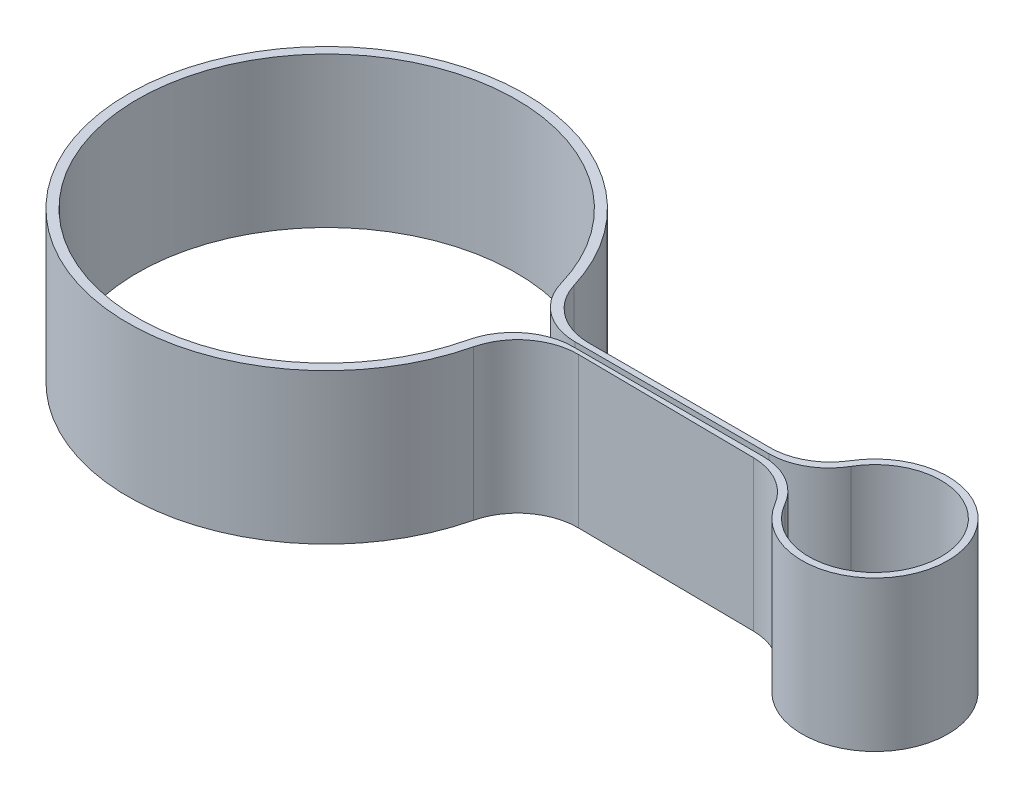
ISO-10303-21;
HEADER;
FILE_DESCRIPTION(('STEP AP214'),'2;1');
FILE_NAME('part.step','',(''),(''),'','','');
FILE_SCHEMA(('AUTOMOTIVE_DESIGN { 1 0 10303 214 1 1 1 1 }'));
ENDSEC;
DATA;
#1=APPLICATION_CONTEXT('core data for automotive mechanical design processes');
#2=APPLICATION_PROTOCOL_DEFINITION('international standard','automotive_design',2000,#1);
#3=PRODUCT_CONTEXT('',#1,'mechanical');
#4=PRODUCT('Part','Part','',(#3));
#5=PRODUCT_RELATED_PRODUCT_CATEGORY('part','',(#4));
#6=PRODUCT_DEFINITION_FORMATION('','',#4);
#7=PRODUCT_DEFINITION_CONTEXT('part definition',#1,'design');
#8=PRODUCT_DEFINITION('design','',#6,#7);
#9=PRODUCT_DEFINITION_SHAPE('','',#8);
#10=(LENGTH_UNIT() NAMED_UNIT(*) SI_UNIT(.MILLI.,.METRE.));
#11=(NAMED_UNIT(*) PLANE_ANGLE_UNIT() SI_UNIT($,.RADIAN.));
#12=(NAMED_UNIT(*) SI_UNIT($,.STERADIAN.) SOLID_ANGLE_UNIT());
#13=UNCERTAINTY_MEASURE_WITH_UNIT(LENGTH_MEASURE(1.E-05),#10,'distance_accuracy_value','');
#14=(GEOMETRIC_REPRESENTATION_CONTEXT(3) GLOBAL_UNCERTAINTY_ASSIGNED_CONTEXT((#13)) GLOBAL_UNIT_ASSIGNED_CONTEXT((#10,
#11,#12)) REPRESENTATION_CONTEXT('',''));
#15=CARTESIAN_POINT('',(0.,0.,0.));
#16=DIRECTION('',(0.,0.,1.));
#17=DIRECTION('',(1.,0.,0.));
#18=AXIS2_PLACEMENT_3D('',#15,#16,#17);
#19=CARTESIAN_POINT('',(34.1578856722715,25.,53.941585042736));
#20=DIRECTION('',(0.,1.,0.));
#21=DIRECTION('',(0.,0.,1.));
#22=AXIS2_PLACEMENT_3D('',#19,#20,#21);
#23=PLANE('',#22);
#24=CARTESIAN_POINT('',(124.422920084334,25.,52.9901319635585));
#25=DIRECTION('',(0.,1.,0.));
#26=DIRECTION('',(0.,0.,1.));
#27=AXIS2_PLACEMENT_3D('',#24,#25,#26);
#28=CIRCLE('',#27,12.1361849976581);
#29=CARTESIAN_POINT('',(113.998690265068,25.,59.2048257591141));
#30=VERTEX_POINT('',#29);
#31=CARTESIAN_POINT('',(114.049539549785,25.,46.690928634341));
#32=VERTEX_POINT('',#31);
#33=EDGE_CURVE('E274',#30,#32,#28,.T.);
#34=ORIENTED_EDGE('',*,*,#33,.T.);
#35=CARTESIAN_POINT('',(105.502058989336,25.,41.5004974317571));
#36=DIRECTION('',(0.,1.,0.));
#37=DIRECTION('',(0.,0.,1.));
#38=AXIS2_PLACEMENT_3D('',#35,#36,#37);
#39=CIRCLE('',#38,10.);
#40=CARTESIAN_POINT('',(105.502058989336,25.,51.5004974317571));
#41=VERTEX_POINT('',#40);
#42=EDGE_CURVE('E229',#32,#41,#39,.F.);
#43=ORIENTED_EDGE('',*,*,#42,.T.);
#44=DIRECTION('',(-1.,0.,0.));
#45=VECTOR('',#44,1.);
#46=CARTESIAN_POINT('',(67.1016716609574,25.,51.5004974317571));
#47=LINE('',#46,#45);
#48=CARTESIAN_POINT('',(75.3544066163508,25.,51.5004974317571));
#49=VERTEX_POINT('',#48);
#50=EDGE_CURVE('E159',#41,#49,#47,.T.);
#51=ORIENTED_EDGE('',*,*,#50,.T.);
#52=CARTESIAN_POINT('',(75.3544066163508,25.,41.5004974317571));
#53=DIRECTION('',(0.,1.,0.));
#54=DIRECTION('',(0.,0.,1.));
#55=AXIS2_PLACEMENT_3D('',#52,#53,#54);
#56=CIRCLE('',#55,10.);
#57=CARTESIAN_POINT('',(65.7814125677197,25.,44.3914808189239));
#58=VERTEX_POINT('',#57);
#59=EDGE_CURVE('E201',#49,#58,#56,.F.);
#60=ORIENTED_EDGE('',*,*,#59,.T.);
#61=CARTESIAN_POINT('',(34.1578856722715,25.,53.941585042736));
#62=DIRECTION('',(0.,1.,0.));
#63=DIRECTION('',(0.,0.,1.));
#64=AXIS2_PLACEMENT_3D('',#61,#62,#63);
#65=CIRCLE('',#64,33.0341027423602);
#66=CARTESIAN_POINT('',(66.2746295842427,25.,61.672477907449));
#67=VERTEX_POINT('',#66);
#68=EDGE_CURVE('E173',#58,#67,#65,.T.);
#69=ORIENTED_EDGE('',*,*,#68,.T.);
#70=CARTESIAN_POINT('',(75.9969290401887,25.,64.0127542349181));
#71=DIRECTION('',(0.,1.,0.));
#72=DIRECTION('',(0.,0.,1.));
#73=AXIS2_PLACEMENT_3D('',#70,#71,#72);
#74=CIRCLE('',#73,10.);
#75=CARTESIAN_POINT('',(76.1032960394246,25.,54.013319947846));
#76=VERTEX_POINT('',#75);
#77=EDGE_CURVE('E154',#67,#76,#74,.F.);
#78=ORIENTED_EDGE('',*,*,#77,.T.);
#79=DIRECTION('',(0.999943428707212,0.,0.0106366999235841));
#80=VECTOR('',#79,1.);
#81=CARTESIAN_POINT('',(67.1919803677054,25.,53.9185275945956));
#82=LINE('',#81,#80);
#83=CARTESIAN_POINT('',(105.515677800101,25.,54.3261883260408));
#84=VERTEX_POINT('',#83);
#85=EDGE_CURVE('E158',#76,#84,#82,.T.);
#86=ORIENTED_EDGE('',*,*,#85,.T.);
#87=CARTESIAN_POINT('',(105.409310800865,25.,64.3256226131129));
#88=DIRECTION('',(0.,1.,0.));
#89=DIRECTION('',(0.,0.,1.));
#90=AXIS2_PLACEMENT_3D('',#87,#88,#89);
#91=CIRCLE('',#90,10.);
#92=EDGE_CURVE('E232',#84,#30,#91,.F.);
#93=ORIENTED_EDGE('',*,*,#92,.T.);
#94=EDGE_LOOP('',(#34,#43,#51,#60,#69,#78,#86,#93));
#95=FACE_BOUND('',#94,.T.);
#96=DIRECTION('',(-1.,0.,0.));
#97=VECTOR('',#96,1.);
#98=CARTESIAN_POINT('',(65.6237177244648,25.,52.4748153733051));
#99=LINE('',#98,#97);
#100=CARTESIAN_POINT('',(106.245238246246,25.,52.4748153733051));
#101=VERTEX_POINT('',#100);
#102=CARTESIAN_POINT('',(74.042258468496,25.,52.4748153733051));
#103=VERTEX_POINT('',#102);
#104=EDGE_CURVE('E169',#101,#103,#99,.T.);
#105=ORIENTED_EDGE('',*,*,#104,.F.);
#106=CARTESIAN_POINT('',(106.245238246246,25.,42.4748153733051));
#107=DIRECTION('',(0.,1.,0.));
#108=DIRECTION('',(0.,0.,1.));
#109=AXIS2_PLACEMENT_3D('',#106,#107,#108);
#110=CIRCLE('',#109,10.);
#111=CARTESIAN_POINT('',(114.901277216764,25.,47.4821089877115));
#112=VERTEX_POINT('',#111);
#113=EDGE_CURVE('E11',#101,#112,#110,.T.);
#114=ORIENTED_EDGE('',*,*,#113,.T.);
#115=CARTESIAN_POINT('',(124.422920084334,25.,52.9901319635585));
#116=DIRECTION('',(0.,1.,0.));
#117=DIRECTION('',(0.,0.,1.));
#118=AXIS2_PLACEMENT_3D('',#115,#116,#117);
#119=CIRCLE('',#118,11.);
#120=CARTESIAN_POINT('',(114.85306942242,25.,58.4139644009294));
#121=VERTEX_POINT('',#120);
#122=EDGE_CURVE('E246',#121,#112,#119,.T.);
#123=ORIENTED_EDGE('',*,*,#122,.F.);
#124=CARTESIAN_POINT('',(106.153205184317,25.,63.3447211621756));
#125=DIRECTION('',(0.,1.,0.));
#126=DIRECTION('',(0.,0.,1.));
#127=AXIS2_PLACEMENT_3D('',#124,#125,#126);
#128=CIRCLE('',#127,10.);
#129=CARTESIAN_POINT('',(106.153318338104,25.,53.3447211628158));
#130=VERTEX_POINT('',#129);
#131=EDGE_CURVE('E39',#121,#130,#128,.T.);
#132=ORIENTED_EDGE('',*,*,#131,.T.);
#133=DIRECTION('',(0.999999999935981,0.,1.13153786721083E-05));
#134=VECTOR('',#133,1.);
#135=CARTESIAN_POINT('',(65.6522217699098,25.,53.3442628775714));
#136=LINE('',#135,#134);
#137=CARTESIAN_POINT('',(74.5787577261709,25.,53.344363884706));
#138=VERTEX_POINT('',#137);
#139=EDGE_CURVE('E243',#138,#130,#136,.T.);
#140=ORIENTED_EDGE('',*,*,#139,.F.);
#141=CARTESIAN_POINT('',(74.5786445723842,25.,63.3443638840658));
#142=DIRECTION('',(0.,1.,0.));
#143=DIRECTION('',(0.,0.,1.));
#144=AXIS2_PLACEMENT_3D('',#141,#142,#143);
#145=CIRCLE('',#144,10.);
#146=CARTESIAN_POINT('',(64.8387026687426,25.,61.0786340427815));
#147=VERTEX_POINT('',#146);
#148=EDGE_CURVE('E184',#138,#147,#145,.T.);
#149=ORIENTED_EDGE('',*,*,#148,.T.);
#150=CARTESIAN_POINT('',(34.1578856722715,25.,53.941585042736));
#151=DIRECTION('',(0.,1.,0.));
#152=DIRECTION('',(0.,0.,1.));
#153=AXIS2_PLACEMENT_3D('',#150,#151,#152);
#154=CIRCLE('',#153,31.5);
#155=CARTESIAN_POINT('',(64.4315662284419,25.,45.2378924020836));
#156=VERTEX_POINT('',#155);
#157=EDGE_CURVE('E255',#156,#147,#154,.T.);
#158=ORIENTED_EDGE('',*,*,#157,.F.);
#159=CARTESIAN_POINT('',(74.042258468496,25.,42.4748153733051));
#160=DIRECTION('',(0.,1.,0.));
#161=DIRECTION('',(0.,0.,1.));
#162=AXIS2_PLACEMENT_3D('',#159,#160,#161);
#163=CIRCLE('',#162,10.);
#164=EDGE_CURVE('E205',#156,#103,#163,.T.);
#165=ORIENTED_EDGE('',*,*,#164,.T.);
#166=EDGE_LOOP('',(#105,#114,#123,#132,#140,#149,#158,#165));
#167=FACE_BOUND('',#166,.T.);
#168=ADVANCED_FACE('F31',(#95,#167),#23,.T.);
#169=CARTESIAN_POINT('',(34.1578856722715,0.,53.941585042736));
#170=DIRECTION('',(0.,1.,0.));
#171=DIRECTION('',(0.,0.,1.));
#172=AXIS2_PLACEMENT_3D('',#169,#170,#171);
#173=PLANE('',#172);
#174=CARTESIAN_POINT('',(34.1578856722715,0.,53.941585042736));
#175=DIRECTION('',(0.,1.,0.));
#176=DIRECTION('',(0.,0.,1.));
#177=AXIS2_PLACEMENT_3D('',#174,#175,#176);
#178=CIRCLE('',#177,33.0341027423602);
#179=CARTESIAN_POINT('',(65.7814125677197,0.,44.3914808189239));
#180=VERTEX_POINT('',#179);
#181=CARTESIAN_POINT('',(66.2746295842427,0.,61.672477907449));
#182=VERTEX_POINT('',#181);
#183=EDGE_CURVE('E164',#180,#182,#178,.T.);
#184=ORIENTED_EDGE('',*,*,#183,.F.);
#185=CARTESIAN_POINT('',(75.3544066163508,0.,41.5004974317571));
#186=DIRECTION('',(0.,1.,0.));
#187=DIRECTION('',(0.,0.,1.));
#188=AXIS2_PLACEMENT_3D('',#185,#186,#187);
#189=CIRCLE('',#188,10.);
#190=CARTESIAN_POINT('',(75.3544066163508,0.,51.5004974317571));
#191=VERTEX_POINT('',#190);
#192=EDGE_CURVE('E198',#180,#191,#189,.T.);
#193=ORIENTED_EDGE('',*,*,#192,.T.);
#194=DIRECTION('',(-1.,0.,0.));
#195=VECTOR('',#194,1.);
#196=CARTESIAN_POINT('',(67.1016716609574,0.,51.5004974317571));
#197=LINE('',#196,#195);
#198=CARTESIAN_POINT('',(105.502058989336,0.,51.5004974317571));
#199=VERTEX_POINT('',#198);
#200=EDGE_CURVE('E167',#199,#191,#197,.T.);
#201=ORIENTED_EDGE('',*,*,#200,.F.);
#202=CARTESIAN_POINT('',(105.502058989336,0.,41.5004974317571));
#203=DIRECTION('',(0.,1.,0.));
#204=DIRECTION('',(0.,0.,1.));
#205=AXIS2_PLACEMENT_3D('',#202,#203,#204);
#206=CIRCLE('',#205,10.);
#207=CARTESIAN_POINT('',(114.049539549785,0.,46.690928634341));
#208=VERTEX_POINT('',#207);
#209=EDGE_CURVE('E227',#199,#208,#206,.T.);
#210=ORIENTED_EDGE('',*,*,#209,.T.);
#211=CARTESIAN_POINT('',(124.422920084334,0.,52.9901319635585));
#212=DIRECTION('',(0.,1.,0.));
#213=DIRECTION('',(0.,0.,1.));
#214=AXIS2_PLACEMENT_3D('',#211,#212,#213);
#215=CIRCLE('',#214,12.1361849976581);
#216=CARTESIAN_POINT('',(113.998690265068,0.,59.2048257591141));
#217=VERTEX_POINT('',#216);
#218=EDGE_CURVE('E163',#217,#208,#215,.T.);
#219=ORIENTED_EDGE('',*,*,#218,.F.);
#220=CARTESIAN_POINT('',(105.409310800865,0.,64.3256226131129));
#221=DIRECTION('',(0.,1.,0.));
#222=DIRECTION('',(0.,0.,1.));
#223=AXIS2_PLACEMENT_3D('',#220,#221,#222);
#224=CIRCLE('',#223,10.);
#225=CARTESIAN_POINT('',(105.515677800101,0.,54.3261883260408));
#226=VERTEX_POINT('',#225);
#227=EDGE_CURVE('E46',#217,#226,#224,.T.);
#228=ORIENTED_EDGE('',*,*,#227,.T.);
#229=DIRECTION('',(0.999943428707212,0.,0.0106366999235841));
#230=VECTOR('',#229,1.);
#231=CARTESIAN_POINT('',(67.1919803677054,0.,53.9185275945956));
#232=LINE('',#231,#230);
#233=CARTESIAN_POINT('',(76.1032960394246,0.,54.013319947846));
#234=VERTEX_POINT('',#233);
#235=EDGE_CURVE('E157',#234,#226,#232,.T.);
#236=ORIENTED_EDGE('',*,*,#235,.F.);
#237=CARTESIAN_POINT('',(75.9969290401887,0.,64.0127542349181));
#238=DIRECTION('',(0.,1.,0.));
#239=DIRECTION('',(0.,0.,1.));
#240=AXIS2_PLACEMENT_3D('',#237,#238,#239);
#241=CIRCLE('',#240,10.);
#242=EDGE_CURVE('E146',#234,#182,#241,.T.);
#243=ORIENTED_EDGE('',*,*,#242,.T.);
#244=EDGE_LOOP('',(#184,#193,#201,#210,#219,#228,#236,#243));
#245=FACE_BOUND('',#244,.T.);
#246=CARTESIAN_POINT('',(124.422920084334,0.,52.9901319635585));
#247=DIRECTION('',(0.,1.,0.));
#248=DIRECTION('',(0.,0.,1.));
#249=AXIS2_PLACEMENT_3D('',#246,#247,#248);
#250=CIRCLE('',#249,11.);
#251=CARTESIAN_POINT('',(114.85306942242,0.,58.4139644009294));
#252=VERTEX_POINT('',#251);
#253=CARTESIAN_POINT('',(114.901277216764,0.,47.4821089877115));
#254=VERTEX_POINT('',#253);
#255=EDGE_CURVE('E260',#252,#254,#250,.T.);
#256=ORIENTED_EDGE('',*,*,#255,.T.);
#257=CARTESIAN_POINT('',(106.245238246246,0.,42.4748153733051));
#258=DIRECTION('',(0.,1.,0.));
#259=DIRECTION('',(0.,0.,1.));
#260=AXIS2_PLACEMENT_3D('',#257,#258,#259);
#261=CIRCLE('',#260,10.);
#262=CARTESIAN_POINT('',(106.245238246246,0.,52.4748153733051));
#263=VERTEX_POINT('',#262);
#264=EDGE_CURVE('E236',#254,#263,#261,.F.);
#265=ORIENTED_EDGE('',*,*,#264,.T.);
#266=DIRECTION('',(-1.,0.,0.));
#267=VECTOR('',#266,1.);
#268=CARTESIAN_POINT('',(65.6237177244648,0.,52.4748153733051));
#269=LINE('',#268,#267);
#270=CARTESIAN_POINT('',(74.042258468496,0.,52.4748153733051));
#271=VERTEX_POINT('',#270);
#272=EDGE_CURVE('E265',#263,#271,#269,.T.);
#273=ORIENTED_EDGE('',*,*,#272,.T.);
#274=CARTESIAN_POINT('',(74.042258468496,0.,42.4748153733051));
#275=DIRECTION('',(0.,1.,0.));
#276=DIRECTION('',(0.,0.,1.));
#277=AXIS2_PLACEMENT_3D('',#274,#275,#276);
#278=CIRCLE('',#277,10.);
#279=CARTESIAN_POINT('',(64.4315662284419,0.,45.2378924020836));
#280=VERTEX_POINT('',#279);
#281=EDGE_CURVE('E203',#271,#280,#278,.F.);
#282=ORIENTED_EDGE('',*,*,#281,.T.);
#283=CARTESIAN_POINT('',(34.1578856722715,0.,53.941585042736));
#284=DIRECTION('',(0.,1.,0.));
#285=DIRECTION('',(0.,0.,1.));
#286=AXIS2_PLACEMENT_3D('',#283,#284,#285);
#287=CIRCLE('',#286,31.5);
#288=CARTESIAN_POINT('',(64.8387026687426,0.,61.0786340427815));
#289=VERTEX_POINT('',#288);
#290=EDGE_CURVE('E268',#280,#289,#287,.T.);
#291=ORIENTED_EDGE('',*,*,#290,.T.);
#292=CARTESIAN_POINT('',(74.5786445723842,0.,63.3443638840658));
#293=DIRECTION('',(0.,1.,0.));
#294=DIRECTION('',(0.,0.,1.));
#295=AXIS2_PLACEMENT_3D('',#292,#293,#294);
#296=CIRCLE('',#295,10.);
#297=CARTESIAN_POINT('',(74.5787577261709,0.,53.344363884706));
#298=VERTEX_POINT('',#297);
#299=EDGE_CURVE('E180',#289,#298,#296,.F.);
#300=ORIENTED_EDGE('',*,*,#299,.T.);
#301=DIRECTION('',(0.999999999935981,0.,1.13153786721083E-05));
#302=VECTOR('',#301,1.);
#303=CARTESIAN_POINT('',(65.6522217699098,0.,53.3442628775714));
#304=LINE('',#303,#302);
#305=CARTESIAN_POINT('',(106.153318338104,0.,53.3447211628158));
#306=VERTEX_POINT('',#305);
#307=EDGE_CURVE('E261',#298,#306,#304,.T.);
#308=ORIENTED_EDGE('',*,*,#307,.T.);
#309=CARTESIAN_POINT('',(106.153205184317,0.,63.3447211621756));
#310=DIRECTION('',(0.,1.,0.));
#311=DIRECTION('',(0.,0.,1.));
#312=AXIS2_PLACEMENT_3D('',#309,#310,#311);
#313=CIRCLE('',#312,10.);
#314=EDGE_CURVE('E234',#306,#252,#313,.F.);
#315=ORIENTED_EDGE('',*,*,#314,.T.);
#316=EDGE_LOOP('',(#256,#265,#273,#282,#291,#300,#308,#315));
#317=FACE_BOUND('',#316,.T.);
#318=ADVANCED_FACE('F161',(#245,#317),#173,.F.);
#319=CARTESIAN_POINT('',(34.1578856722715,25.,53.941585042736));
#320=DIRECTION('',(0.,-1.,0.));
#321=DIRECTION('',(0.,0.,-1.));
#322=AXIS2_PLACEMENT_3D('',#319,#320,#321);
#323=CYLINDRICAL_SURFACE('',#322,33.0341027423602);
#324=ORIENTED_EDGE('',*,*,#68,.F.);
#325=DIRECTION('',(0.,-1.,0.));
#326=VECTOR('',#325,1.);
#327=CARTESIAN_POINT('',(65.7814125677197,25.,44.3914808189239));
#328=LINE('',#327,#326);
#329=EDGE_CURVE('E187',#58,#180,#328,.T.);
#330=ORIENTED_EDGE('',*,*,#329,.T.);
#331=ORIENTED_EDGE('',*,*,#183,.T.);
#332=DIRECTION('',(0.,-1.,0.));
#333=VECTOR('',#332,1.);
#334=CARTESIAN_POINT('',(66.2746295842427,25.,61.672477907449));
#335=LINE('',#334,#333);
#336=EDGE_CURVE('E152',#182,#67,#335,.F.);
#337=ORIENTED_EDGE('',*,*,#336,.T.);
#338=EDGE_LOOP('',(#324,#330,#331,#337));
#339=FACE_BOUND('',#338,.T.);
#340=ADVANCED_FACE('F290',(#339),#323,.T.);
#341=CARTESIAN_POINT('',(67.1919803677054,25.,53.9185275945956));
#342=DIRECTION('',(0.0106366999235841,0.,-0.999943428707212));
#343=DIRECTION('',(-0.999943428707212,0.,-0.0106366999235841));
#344=AXIS2_PLACEMENT_3D('',#341,#342,#343);
#345=PLANE('',#344);
#346=ORIENTED_EDGE('',*,*,#235,.T.);
#347=DIRECTION('',(0.,1.,0.));
#348=VECTOR('',#347,1.);
#349=CARTESIAN_POINT('',(105.515677800101,25.,54.3261883260408));
#350=LINE('',#349,#348);
#351=EDGE_CURVE('E53',#226,#84,#350,.T.);
#352=ORIENTED_EDGE('',*,*,#351,.T.);
#353=ORIENTED_EDGE('',*,*,#85,.F.);
#354=DIRECTION('',(0.,1.,0.));
#355=VECTOR('',#354,1.);
#356=CARTESIAN_POINT('',(76.1032960394246,0.,54.013319947846));
#357=LINE('',#356,#355);
#358=EDGE_CURVE('E150',#76,#234,#357,.F.);
#359=ORIENTED_EDGE('',*,*,#358,.T.);
#360=EDGE_LOOP('',(#346,#352,#353,#359));
#361=FACE_BOUND('',#360,.T.);
#362=ADVANCED_FACE('F156',(#361),#345,.F.);
#363=CARTESIAN_POINT('',(124.422920084334,25.,52.9901319635585));
#364=DIRECTION('',(0.,-1.,0.));
#365=DIRECTION('',(0.,0.,-1.));
#366=AXIS2_PLACEMENT_3D('',#363,#364,#365);
#367=CYLINDRICAL_SURFACE('',#366,12.1361849976581);
#368=ORIENTED_EDGE('',*,*,#218,.T.);
#369=DIRECTION('',(0.,-1.,0.));
#370=VECTOR('',#369,1.);
#371=CARTESIAN_POINT('',(114.049539549785,25.,46.690928634341));
#372=LINE('',#371,#370);
#373=EDGE_CURVE('E224',#208,#32,#372,.F.);
#374=ORIENTED_EDGE('',*,*,#373,.T.);
#375=ORIENTED_EDGE('',*,*,#33,.F.);
#376=DIRECTION('',(0.,-1.,0.));
#377=VECTOR('',#376,1.);
#378=CARTESIAN_POINT('',(113.998690265068,25.,59.2048257591141));
#379=LINE('',#378,#377);
#380=EDGE_CURVE('E221',#30,#217,#379,.T.);
#381=ORIENTED_EDGE('',*,*,#380,.T.);
#382=EDGE_LOOP('',(#368,#374,#375,#381));
#383=FACE_BOUND('',#382,.T.);
#384=ADVANCED_FACE('F294',(#383),#367,.T.);
#385=CARTESIAN_POINT('',(67.1016716609574,25.,51.5004974317571));
#386=DIRECTION('',(0.,0.,1.));
#387=DIRECTION('',(1.,0.,0.));
#388=AXIS2_PLACEMENT_3D('',#385,#386,#387);
#389=PLANE('',#388);
#390=ORIENTED_EDGE('',*,*,#50,.F.);
#391=DIRECTION('',(0.,1.,0.));
#392=VECTOR('',#391,1.);
#393=CARTESIAN_POINT('',(105.502058989336,0.,51.5004974317571));
#394=LINE('',#393,#392);
#395=EDGE_CURVE('E218',#41,#199,#394,.F.);
#396=ORIENTED_EDGE('',*,*,#395,.T.);
#397=ORIENTED_EDGE('',*,*,#200,.T.);
#398=DIRECTION('',(0.,1.,0.));
#399=VECTOR('',#398,1.);
#400=CARTESIAN_POINT('',(75.3544066163508,25.,51.5004974317571));
#401=LINE('',#400,#399);
#402=EDGE_CURVE('E190',#191,#49,#401,.T.);
#403=ORIENTED_EDGE('',*,*,#402,.T.);
#404=EDGE_LOOP('',(#390,#396,#397,#403));
#405=FACE_BOUND('',#404,.T.);
#406=ADVANCED_FACE('F284',(#405),#389,.F.);
#407=CARTESIAN_POINT('',(34.1578856722715,25.,53.941585042736));
#408=DIRECTION('',(0.,-1.,0.));
#409=DIRECTION('',(0.,0.,-1.));
#410=AXIS2_PLACEMENT_3D('',#407,#408,#409);
#411=CYLINDRICAL_SURFACE('',#410,31.5);
#412=ORIENTED_EDGE('',*,*,#290,.F.);
#413=DIRECTION('',(0.,-1.,0.));
#414=VECTOR('',#413,1.);
#415=CARTESIAN_POINT('',(64.4315662284419,25.,45.2378924020836));
#416=LINE('',#415,#414);
#417=EDGE_CURVE('E196',#280,#156,#416,.F.);
#418=ORIENTED_EDGE('',*,*,#417,.T.);
#419=ORIENTED_EDGE('',*,*,#157,.T.);
#420=DIRECTION('',(0.,-1.,0.));
#421=VECTOR('',#420,1.);
#422=CARTESIAN_POINT('',(64.8387026687426,25.,61.0786340427815));
#423=LINE('',#422,#421);
#424=EDGE_CURVE('E177',#147,#289,#423,.T.);
#425=ORIENTED_EDGE('',*,*,#424,.T.);
#426=EDGE_LOOP('',(#412,#418,#419,#425));
#427=FACE_BOUND('',#426,.T.);
#428=ADVANCED_FACE('F313',(#427),#411,.F.);
#429=CARTESIAN_POINT('',(65.6522217699098,25.,53.3442628775714));
#430=DIRECTION('',(1.13153786721083E-05,0.,-0.999999999935981));
#431=DIRECTION('',(-0.999999999935981,0.,-1.13153786721083E-05));
#432=AXIS2_PLACEMENT_3D('',#429,#430,#431);
#433=PLANE('',#432);
#434=ORIENTED_EDGE('',*,*,#139,.T.);
#435=DIRECTION('',(0.,-1.,0.));
#436=VECTOR('',#435,1.);
#437=CARTESIAN_POINT('',(106.153318338104,25.,53.3447211628158));
#438=LINE('',#437,#436);
#439=EDGE_CURVE('E215',#130,#306,#438,.T.);
#440=ORIENTED_EDGE('',*,*,#439,.T.);
#441=ORIENTED_EDGE('',*,*,#307,.F.);
#442=DIRECTION('',(0.,-1.,0.));
#443=VECTOR('',#442,1.);
#444=CARTESIAN_POINT('',(74.5787577261709,25.,53.344363884706));
#445=LINE('',#444,#443);
#446=EDGE_CURVE('E182',#298,#138,#445,.F.);
#447=ORIENTED_EDGE('',*,*,#446,.T.);
#448=EDGE_LOOP('',(#434,#440,#441,#447));
#449=FACE_BOUND('',#448,.T.);
#450=ADVANCED_FACE('F251',(#449),#433,.T.);
#451=CARTESIAN_POINT('',(124.422920084334,25.,52.9901319635585));
#452=DIRECTION('',(0.,-1.,0.));
#453=DIRECTION('',(0.,0.,-1.));
#454=AXIS2_PLACEMENT_3D('',#451,#452,#453);
#455=CYLINDRICAL_SURFACE('',#454,11.);
#456=ORIENTED_EDGE('',*,*,#122,.T.);
#457=DIRECTION('',(0.,-1.,0.));
#458=VECTOR('',#457,1.);
#459=CARTESIAN_POINT('',(114.901277216764,25.,47.4821089877115));
#460=LINE('',#459,#458);
#461=EDGE_CURVE('E210',#112,#254,#460,.T.);
#462=ORIENTED_EDGE('',*,*,#461,.T.);
#463=ORIENTED_EDGE('',*,*,#255,.F.);
#464=DIRECTION('',(0.,-1.,0.));
#465=VECTOR('',#464,1.);
#466=CARTESIAN_POINT('',(114.85306942242,25.,58.4139644009294));
#467=LINE('',#466,#465);
#468=EDGE_CURVE('E208',#252,#121,#467,.F.);
#469=ORIENTED_EDGE('',*,*,#468,.T.);
#470=EDGE_LOOP('',(#456,#462,#463,#469));
#471=FACE_BOUND('',#470,.T.);
#472=ADVANCED_FACE('F263',(#471),#455,.F.);
#473=CARTESIAN_POINT('',(65.6237177244648,25.,52.4748153733051));
#474=DIRECTION('',(0.,0.,1.));
#475=DIRECTION('',(1.,0.,0.));
#476=AXIS2_PLACEMENT_3D('',#473,#474,#475);
#477=PLANE('',#476);
#478=ORIENTED_EDGE('',*,*,#272,.F.);
#479=DIRECTION('',(0.,-1.,0.));
#480=VECTOR('',#479,1.);
#481=CARTESIAN_POINT('',(106.245238246246,25.,52.4748153733051));
#482=LINE('',#481,#480);
#483=EDGE_CURVE('E213',#263,#101,#482,.F.);
#484=ORIENTED_EDGE('',*,*,#483,.T.);
#485=ORIENTED_EDGE('',*,*,#104,.T.);
#486=DIRECTION('',(0.,-1.,0.));
#487=VECTOR('',#486,1.);
#488=CARTESIAN_POINT('',(74.042258468496,25.,52.4748153733051));
#489=LINE('',#488,#487);
#490=EDGE_CURVE('E193',#103,#271,#489,.T.);
#491=ORIENTED_EDGE('',*,*,#490,.T.);
#492=EDGE_LOOP('',(#478,#484,#485,#491));
#493=FACE_BOUND('',#492,.T.);
#494=ADVANCED_FACE('F327',(#493),#477,.T.);
#495=CARTESIAN_POINT('',(75.9969290401887,25.,64.0127542349181));
#496=DIRECTION('',(0.,-1.,0.));
#497=DIRECTION('',(0.,0.,-1.));
#498=AXIS2_PLACEMENT_3D('',#495,#496,#497);
#499=CYLINDRICAL_SURFACE('',#498,10.);
#500=ORIENTED_EDGE('',*,*,#77,.F.);
#501=ORIENTED_EDGE('',*,*,#336,.F.);
#502=ORIENTED_EDGE('',*,*,#242,.F.);
#503=ORIENTED_EDGE('',*,*,#358,.F.);
#504=EDGE_LOOP('',(#500,#501,#502,#503));
#505=FACE_BOUND('',#504,.T.);
#506=ADVANCED_FACE('F149',(#505),#499,.F.);
#507=CARTESIAN_POINT('',(74.5786445723842,25.,63.3443638840658));
#508=DIRECTION('',(0.,-1.,0.));
#509=DIRECTION('',(0.,0.,-1.));
#510=AXIS2_PLACEMENT_3D('',#507,#508,#509);
#511=CYLINDRICAL_SURFACE('',#510,10.);
#512=ORIENTED_EDGE('',*,*,#148,.F.);
#513=ORIENTED_EDGE('',*,*,#446,.F.);
#514=ORIENTED_EDGE('',*,*,#299,.F.);
#515=ORIENTED_EDGE('',*,*,#424,.F.);
#516=EDGE_LOOP('',(#512,#513,#514,#515));
#517=FACE_BOUND('',#516,.T.);
#518=ADVANCED_FACE('F326',(#517),#511,.T.);
#519=CARTESIAN_POINT('',(75.3544066163508,25.,41.5004974317571));
#520=DIRECTION('',(0.,-1.,0.));
#521=DIRECTION('',(0.,0.,-1.));
#522=AXIS2_PLACEMENT_3D('',#519,#520,#521);
#523=CYLINDRICAL_SURFACE('',#522,10.);
#524=ORIENTED_EDGE('',*,*,#59,.F.);
#525=ORIENTED_EDGE('',*,*,#402,.F.);
#526=ORIENTED_EDGE('',*,*,#192,.F.);
#527=ORIENTED_EDGE('',*,*,#329,.F.);
#528=EDGE_LOOP('',(#524,#525,#526,#527));
#529=FACE_BOUND('',#528,.T.);
#530=ADVANCED_FACE('F288',(#529),#523,.F.);
#531=CARTESIAN_POINT('',(74.042258468496,25.,42.4748153733051));
#532=DIRECTION('',(0.,-1.,0.));
#533=DIRECTION('',(0.,0.,-1.));
#534=AXIS2_PLACEMENT_3D('',#531,#532,#533);
#535=CYLINDRICAL_SURFACE('',#534,10.);
#536=ORIENTED_EDGE('',*,*,#164,.F.);
#537=ORIENTED_EDGE('',*,*,#417,.F.);
#538=ORIENTED_EDGE('',*,*,#281,.F.);
#539=ORIENTED_EDGE('',*,*,#490,.F.);
#540=EDGE_LOOP('',(#536,#537,#538,#539));
#541=FACE_BOUND('',#540,.T.);
#542=ADVANCED_FACE('F333',(#541),#535,.T.);
#543=CARTESIAN_POINT('',(106.245238246246,25.,42.4748153733051));
#544=DIRECTION('',(0.,-1.,0.));
#545=DIRECTION('',(0.,0.,-1.));
#546=AXIS2_PLACEMENT_3D('',#543,#544,#545);
#547=CYLINDRICAL_SURFACE('',#546,10.);
#548=ORIENTED_EDGE('',*,*,#113,.F.);
#549=ORIENTED_EDGE('',*,*,#483,.F.);
#550=ORIENTED_EDGE('',*,*,#264,.F.);
#551=ORIENTED_EDGE('',*,*,#461,.F.);
#552=EDGE_LOOP('',(#548,#549,#550,#551));
#553=FACE_BOUND('',#552,.T.);
#554=ADVANCED_FACE('F304',(#553),#547,.T.);
#555=CARTESIAN_POINT('',(106.153205184317,25.,63.3447211621756));
#556=DIRECTION('',(0.,-1.,0.));
#557=DIRECTION('',(0.,0.,-1.));
#558=AXIS2_PLACEMENT_3D('',#555,#556,#557);
#559=CYLINDRICAL_SURFACE('',#558,10.);
#560=ORIENTED_EDGE('',*,*,#131,.F.);
#561=ORIENTED_EDGE('',*,*,#468,.F.);
#562=ORIENTED_EDGE('',*,*,#314,.F.);
#563=ORIENTED_EDGE('',*,*,#439,.F.);
#564=EDGE_LOOP('',(#560,#561,#562,#563));
#565=FACE_BOUND('',#564,.T.);
#566=ADVANCED_FACE('F257',(#565),#559,.T.);
#567=CARTESIAN_POINT('',(105.502058989336,25.,41.5004974317571));
#568=DIRECTION('',(0.,-1.,0.));
#569=DIRECTION('',(0.,0.,-1.));
#570=AXIS2_PLACEMENT_3D('',#567,#568,#569);
#571=CYLINDRICAL_SURFACE('',#570,10.);
#572=ORIENTED_EDGE('',*,*,#42,.F.);
#573=ORIENTED_EDGE('',*,*,#373,.F.);
#574=ORIENTED_EDGE('',*,*,#209,.F.);
#575=ORIENTED_EDGE('',*,*,#395,.F.);
#576=EDGE_LOOP('',(#572,#573,#574,#575));
#577=FACE_BOUND('',#576,.T.);
#578=ADVANCED_FACE('F297',(#577),#571,.F.);
#579=CARTESIAN_POINT('',(105.409310800865,25.,64.3256226131129));
#580=DIRECTION('',(0.,-1.,0.));
#581=DIRECTION('',(0.,0.,-1.));
#582=AXIS2_PLACEMENT_3D('',#579,#580,#581);
#583=CYLINDRICAL_SURFACE('',#582,10.);
#584=ORIENTED_EDGE('',*,*,#92,.F.);
#585=ORIENTED_EDGE('',*,*,#351,.F.);
#586=ORIENTED_EDGE('',*,*,#227,.F.);
#587=ORIENTED_EDGE('',*,*,#380,.F.);
#588=EDGE_LOOP('',(#584,#585,#586,#587));
#589=FACE_BOUND('',#588,.T.);
#590=ADVANCED_FACE('F33',(#589),#583,.F.);
#591=CLOSED_SHELL('',(#168,#318,#340,#362,#384,#406,#428,#450,#472,#494,#506,#518,#530,#542,
#554,#566,#578,#590));
#592=MANIFOLD_SOLID_BREP('B2',#591);
#593=ADVANCED_BREP_SHAPE_REPRESENTATION('',(#18,#592),#14);
#594=SHAPE_DEFINITION_REPRESENTATION(#9,#593);
ENDSEC;
END-ISO-10303-21;
